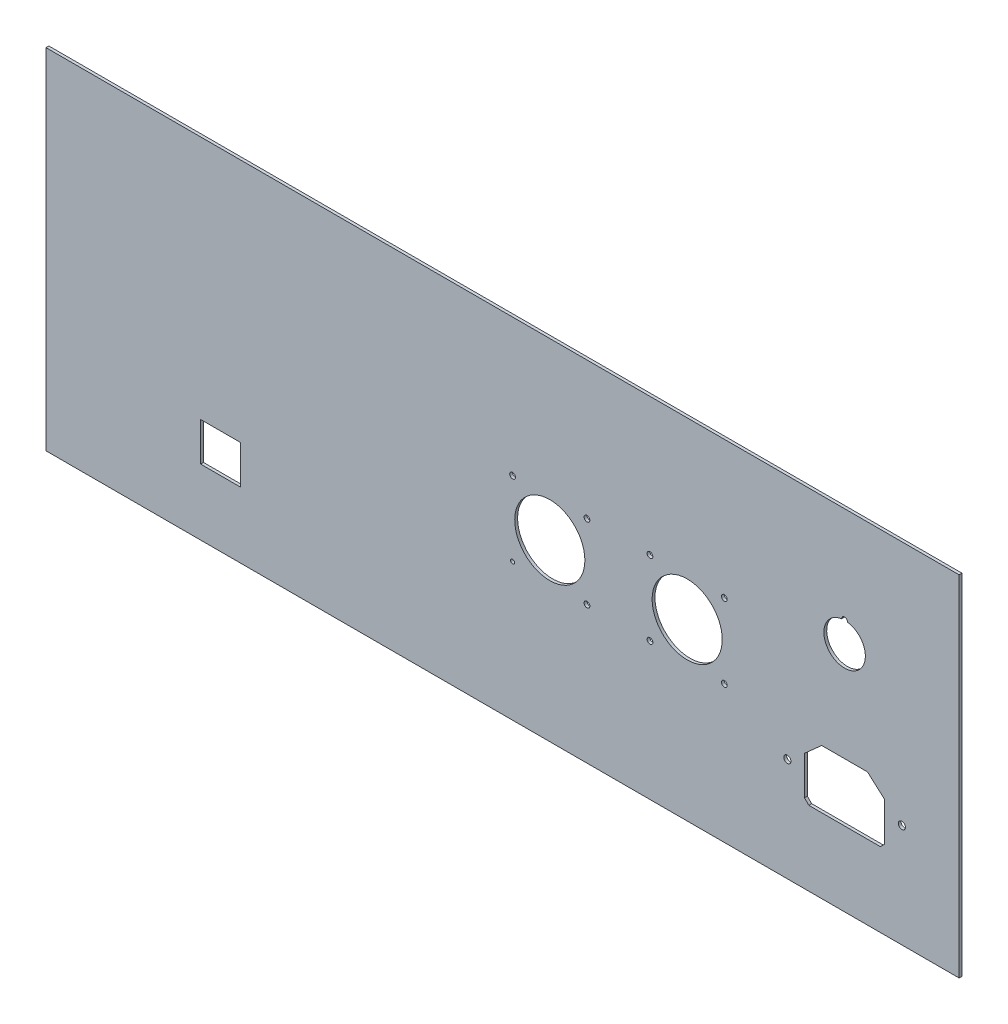
ISO-10303-21;
HEADER;
FILE_DESCRIPTION(('STEP AP214'),'2;1');
FILE_NAME('part.step','',(''),(''),'','','');
FILE_SCHEMA(('AUTOMOTIVE_DESIGN { 1 0 10303 214 1 1 1 1 }'));
ENDSEC;
DATA;
#1=APPLICATION_CONTEXT('core data for automotive mechanical design processes');
#2=APPLICATION_PROTOCOL_DEFINITION('international standard','automotive_design',2000,#1);
#3=PRODUCT_CONTEXT('',#1,'mechanical');
#4=PRODUCT('Part','Part','',(#3));
#5=PRODUCT_RELATED_PRODUCT_CATEGORY('part','',(#4));
#6=PRODUCT_DEFINITION_FORMATION('','',#4);
#7=PRODUCT_DEFINITION_CONTEXT('part definition',#1,'design');
#8=PRODUCT_DEFINITION('design','',#6,#7);
#9=PRODUCT_DEFINITION_SHAPE('','',#8);
#10=(LENGTH_UNIT() NAMED_UNIT(*) SI_UNIT(.MILLI.,.METRE.));
#11=(NAMED_UNIT(*) PLANE_ANGLE_UNIT() SI_UNIT($,.RADIAN.));
#12=(NAMED_UNIT(*) SI_UNIT($,.STERADIAN.) SOLID_ANGLE_UNIT());
#13=UNCERTAINTY_MEASURE_WITH_UNIT(LENGTH_MEASURE(1.E-05),#10,'distance_accuracy_value','');
#14=(GEOMETRIC_REPRESENTATION_CONTEXT(3) GLOBAL_UNCERTAINTY_ASSIGNED_CONTEXT((#13)) GLOBAL_UNIT_ASSIGNED_CONTEXT((#10,
#11,#12)) REPRESENTATION_CONTEXT('',''));
#15=CARTESIAN_POINT('',(0.,0.,0.));
#16=DIRECTION('',(0.,0.,1.));
#17=DIRECTION('',(1.,0.,0.));
#18=AXIS2_PLACEMENT_3D('',#15,#16,#17);
#19=CARTESIAN_POINT('',(-57.699950579006,25.5473317865429,-1.));
#20=DIRECTION('',(-1.,0.,0.));
#21=DIRECTION('',(0.,-1.,0.));
#22=AXIS2_PLACEMENT_3D('',#19,#20,#21);
#23=PLANE('',#22);
#24=DIRECTION('',(0.,-1.,0.));
#25=VECTOR('',#24,1.);
#26=CARTESIAN_POINT('',(-57.699950579006,25.5473317865429,0.));
#27=LINE('',#26,#25);
#28=CARTESIAN_POINT('',(-57.699950579006,25.5473317865429,0.));
#29=VERTEX_POINT('',#28);
#30=CARTESIAN_POINT('',(-57.6999505790059,-96.4526682134571,0.));
#31=VERTEX_POINT('',#30);
#32=EDGE_CURVE('E285',#29,#31,#27,.T.);
#33=ORIENTED_EDGE('',*,*,#32,.F.);
#34=DIRECTION('',(0.,0.,1.));
#35=VECTOR('',#34,1.);
#36=CARTESIAN_POINT('',(-57.699950579006,25.5473317865429,-1.));
#37=LINE('',#36,#35);
#38=CARTESIAN_POINT('',(-57.699950579006,25.5473317865429,-1.));
#39=VERTEX_POINT('',#38);
#40=EDGE_CURVE('E296',#39,#29,#37,.T.);
#41=ORIENTED_EDGE('',*,*,#40,.F.);
#42=DIRECTION('',(0.,-1.,0.));
#43=VECTOR('',#42,1.);
#44=CARTESIAN_POINT('',(-57.699950579006,25.5473317865429,-1.));
#45=LINE('',#44,#43);
#46=CARTESIAN_POINT('',(-57.6999505790059,-96.4526682134571,-1.));
#47=VERTEX_POINT('',#46);
#48=EDGE_CURVE('E271',#39,#47,#45,.T.);
#49=ORIENTED_EDGE('',*,*,#48,.T.);
#50=DIRECTION('',(0.,0.,1.));
#51=VECTOR('',#50,1.);
#52=CARTESIAN_POINT('',(-57.6999505790059,-96.4526682134571,-1.));
#53=LINE('',#52,#51);
#54=EDGE_CURVE('E284',#47,#31,#53,.T.);
#55=ORIENTED_EDGE('',*,*,#54,.T.);
#56=EDGE_LOOP('',(#33,#41,#49,#55));
#57=FACE_BOUND('',#56,.T.);
#58=ADVANCED_FACE('F35',(#57),#23,.T.);
#59=CARTESIAN_POINT('',(-57.699950579006,25.5473317865429,-1.));
#60=DIRECTION('',(0.,1.,0.));
#61=DIRECTION('',(0.,0.,1.));
#62=AXIS2_PLACEMENT_3D('',#59,#60,#61);
#63=PLANE('',#62);
#64=DIRECTION('',(-1.,0.,0.));
#65=VECTOR('',#64,1.);
#66=CARTESIAN_POINT('',(-57.699950579006,25.5473317865429,0.));
#67=LINE('',#66,#65);
#68=CARTESIAN_POINT('',(261.300049420994,25.5473317865429,0.));
#69=VERTEX_POINT('',#68);
#70=EDGE_CURVE('E275',#69,#29,#67,.T.);
#71=ORIENTED_EDGE('',*,*,#70,.F.);
#72=DIRECTION('',(0.,0.,1.));
#73=VECTOR('',#72,1.);
#74=CARTESIAN_POINT('',(261.300049420994,25.5473317865429,-1.));
#75=LINE('',#74,#73);
#76=CARTESIAN_POINT('',(261.300049420994,25.5473317865429,-1.));
#77=VERTEX_POINT('',#76);
#78=EDGE_CURVE('E299',#77,#69,#75,.T.);
#79=ORIENTED_EDGE('',*,*,#78,.F.);
#80=DIRECTION('',(-1.,0.,0.));
#81=VECTOR('',#80,1.);
#82=CARTESIAN_POINT('',(-57.699950579006,25.5473317865429,-1.));
#83=LINE('',#82,#81);
#84=EDGE_CURVE('E281',#77,#39,#83,.T.);
#85=ORIENTED_EDGE('',*,*,#84,.T.);
#86=ORIENTED_EDGE('',*,*,#40,.T.);
#87=EDGE_LOOP('',(#71,#79,#85,#86));
#88=FACE_BOUND('',#87,.T.);
#89=ADVANCED_FACE('F388',(#88),#63,.T.);
#90=CARTESIAN_POINT('',(261.300049420994,25.5473317865429,-1.));
#91=DIRECTION('',(1.,0.,0.));
#92=DIRECTION('',(0.,0.,-1.));
#93=AXIS2_PLACEMENT_3D('',#90,#91,#92);
#94=PLANE('',#93);
#95=DIRECTION('',(0.,1.,0.));
#96=VECTOR('',#95,1.);
#97=CARTESIAN_POINT('',(261.300049420994,25.5473317865429,0.));
#98=LINE('',#97,#96);
#99=CARTESIAN_POINT('',(261.300049420994,-96.4526682134571,0.));
#100=VERTEX_POINT('',#99);
#101=EDGE_CURVE('E291',#100,#69,#98,.T.);
#102=ORIENTED_EDGE('',*,*,#101,.F.);
#103=DIRECTION('',(0.,0.,1.));
#104=VECTOR('',#103,1.);
#105=CARTESIAN_POINT('',(261.300049420994,-96.4526682134571,-1.));
#106=LINE('',#105,#104);
#107=CARTESIAN_POINT('',(261.300049420994,-96.4526682134571,-1.));
#108=VERTEX_POINT('',#107);
#109=EDGE_CURVE('E301',#108,#100,#106,.T.);
#110=ORIENTED_EDGE('',*,*,#109,.F.);
#111=DIRECTION('',(0.,1.,0.));
#112=VECTOR('',#111,1.);
#113=CARTESIAN_POINT('',(261.300049420994,25.5473317865429,-1.));
#114=LINE('',#113,#112);
#115=EDGE_CURVE('E278',#108,#77,#114,.T.);
#116=ORIENTED_EDGE('',*,*,#115,.T.);
#117=ORIENTED_EDGE('',*,*,#78,.T.);
#118=EDGE_LOOP('',(#102,#110,#116,#117));
#119=FACE_BOUND('',#118,.T.);
#120=ADVANCED_FACE('F394',(#119),#94,.T.);
#121=CARTESIAN_POINT('',(-57.6999505790059,-96.4526682134571,-1.));
#122=DIRECTION('',(0.,-1.,0.));
#123=DIRECTION('',(0.,0.,-1.));
#124=AXIS2_PLACEMENT_3D('',#121,#122,#123);
#125=PLANE('',#124);
#126=DIRECTION('',(1.,0.,0.));
#127=VECTOR('',#126,1.);
#128=CARTESIAN_POINT('',(-57.6999505790059,-96.4526682134571,0.));
#129=LINE('',#128,#127);
#130=EDGE_CURVE('E288',#31,#100,#129,.T.);
#131=ORIENTED_EDGE('',*,*,#130,.F.);
#132=ORIENTED_EDGE('',*,*,#54,.F.);
#133=DIRECTION('',(1.,0.,0.));
#134=VECTOR('',#133,1.);
#135=CARTESIAN_POINT('',(-57.6999505790059,-96.4526682134571,-1.));
#136=LINE('',#135,#134);
#137=EDGE_CURVE('E274',#47,#108,#136,.T.);
#138=ORIENTED_EDGE('',*,*,#137,.T.);
#139=ORIENTED_EDGE('',*,*,#109,.T.);
#140=EDGE_LOOP('',(#131,#132,#138,#139));
#141=FACE_BOUND('',#140,.T.);
#142=ADVANCED_FACE('F399',(#141),#125,.T.);
#143=CARTESIAN_POINT('',(0.,0.,-1.));
#144=DIRECTION('',(0.,0.,1.));
#145=DIRECTION('',(1.,0.,0.));
#146=AXIS2_PLACEMENT_3D('',#143,#144,#145);
#147=PLANE('',#146);
#148=DIRECTION('',(-1.,0.,0.));
#149=VECTOR('',#148,1.);
#150=CARTESIAN_POINT('',(10.3000494209939,-73.452668213458,-1.));
#151=LINE('',#150,#149);
#152=CARTESIAN_POINT('',(10.3000494209939,-73.452668213458,-1.));
#153=VERTEX_POINT('',#152);
#154=CARTESIAN_POINT('',(-3.69995057900612,-73.452668213458,-1.));
#155=VERTEX_POINT('',#154);
#156=EDGE_CURVE('E171',#153,#155,#151,.T.);
#157=ORIENTED_EDGE('',*,*,#156,.F.);
#158=DIRECTION('',(0.,-1.,0.));
#159=VECTOR('',#158,1.);
#160=CARTESIAN_POINT('',(10.3000494209939,-59.952668213458,-1.));
#161=LINE('',#160,#159);
#162=CARTESIAN_POINT('',(10.3000494209939,-59.952668213458,-1.));
#163=VERTEX_POINT('',#162);
#164=EDGE_CURVE('E50',#163,#153,#161,.T.);
#165=ORIENTED_EDGE('',*,*,#164,.F.);
#166=DIRECTION('',(1.,0.,0.));
#167=VECTOR('',#166,1.);
#168=CARTESIAN_POINT('',(10.3000494209939,-59.952668213458,-1.));
#169=LINE('',#168,#167);
#170=CARTESIAN_POINT('',(-3.69995057900612,-59.952668213458,-1.));
#171=VERTEX_POINT('',#170);
#172=EDGE_CURVE('E178',#171,#163,#169,.T.);
#173=ORIENTED_EDGE('',*,*,#172,.F.);
#174=DIRECTION('',(0.,1.,0.));
#175=VECTOR('',#174,1.);
#176=CARTESIAN_POINT('',(-3.69995057900612,-59.952668213458,-1.));
#177=LINE('',#176,#175);
#178=EDGE_CURVE('E162',#155,#171,#177,.T.);
#179=ORIENTED_EDGE('',*,*,#178,.F.);
#180=EDGE_LOOP('',(#157,#165,#173,#179));
#181=FACE_BOUND('',#180,.T.);
#182=CARTESIAN_POINT('',(201.300049425371,-60.2752341321196,-1.));
#183=DIRECTION('',(0.,0.,-1.));
#184=DIRECTION('',(-1.,0.,0.));
#185=AXIS2_PLACEMENT_3D('',#182,#183,#184);
#186=CIRCLE('',#185,1.25000000000001);
#187=CARTESIAN_POINT('',(200.050049425371,-60.2752341321196,-1.));
#188=VERTEX_POINT('',#187);
#189=EDGE_CURVE('E185',#188,#188,#186,.T.);
#190=ORIENTED_EDGE('',*,*,#189,.F.);
#191=EDGE_LOOP('',(#190));
#192=FACE_BOUND('',#191,.T.);
#193=CARTESIAN_POINT('',(241.300049425371,-60.2752341321197,-1.));
#194=DIRECTION('',(0.,0.,-1.));
#195=DIRECTION('',(-1.,0.,0.));
#196=AXIS2_PLACEMENT_3D('',#193,#194,#195);
#197=CIRCLE('',#196,1.25000000000001);
#198=CARTESIAN_POINT('',(240.050049425371,-60.2752341321197,-1.));
#199=VERTEX_POINT('',#198);
#200=EDGE_CURVE('E191',#199,#199,#197,.T.);
#201=ORIENTED_EDGE('',*,*,#200,.F.);
#202=EDGE_LOOP('',(#201));
#203=FACE_BOUND('',#202,.T.);
#204=DIRECTION('',(0.746332426877867,0.66557336830029,0.));
#205=VECTOR('',#204,1.);
#206=CARTESIAN_POINT('',(213.300049420994,-50.1019155649255,-1.));
#207=LINE('',#206,#205);
#208=CARTESIAN_POINT('',(207.300049420994,-55.4526682134571,-1.));
#209=VERTEX_POINT('',#208);
#210=CARTESIAN_POINT('',(213.300049420994,-50.1019155649255,-1.));
#211=VERTEX_POINT('',#210);
#212=EDGE_CURVE('E197',#209,#211,#207,.T.);
#213=ORIENTED_EDGE('',*,*,#212,.F.);
#214=DIRECTION('',(0.,1.,0.));
#215=VECTOR('',#214,1.);
#216=CARTESIAN_POINT('',(207.300049420994,-55.4526682134571,-1.));
#217=LINE('',#216,#215);
#218=CARTESIAN_POINT('',(207.300049420994,-68.9526682134571,-1.));
#219=VERTEX_POINT('',#218);
#220=EDGE_CURVE('E195',#219,#209,#217,.T.);
#221=ORIENTED_EDGE('',*,*,#220,.F.);
#222=DIRECTION('',(-0.707106781186548,0.707106781186548,0.));
#223=VECTOR('',#222,1.);
#224=CARTESIAN_POINT('',(69.1736906037684,69.1736906037684,-1.));
#225=LINE('',#224,#223);
#226=CARTESIAN_POINT('',(208.800049420994,-70.4526682134571,-1.));
#227=VERTEX_POINT('',#226);
#228=EDGE_CURVE('E357',#219,#227,#225,.F.);
#229=ORIENTED_EDGE('',*,*,#228,.T.);
#230=DIRECTION('',(-1.,0.,0.));
#231=VECTOR('',#230,1.);
#232=CARTESIAN_POINT('',(235.300049420994,-70.4526682134571,-1.));
#233=LINE('',#232,#231);
#234=CARTESIAN_POINT('',(233.800049420994,-70.4526682134571,-1.));
#235=VERTEX_POINT('',#234);
#236=EDGE_CURVE('E209',#235,#227,#233,.T.);
#237=ORIENTED_EDGE('',*,*,#236,.F.);
#238=DIRECTION('',(-0.707106781186548,-0.707106781186548,0.));
#239=VECTOR('',#238,1.);
#240=CARTESIAN_POINT('',(152.126358817226,-152.126358817226,-1.));
#241=LINE('',#240,#239);
#242=CARTESIAN_POINT('',(235.300049420994,-68.952668213457,-1.));
#243=VERTEX_POINT('',#242);
#244=EDGE_CURVE('E361',#235,#243,#241,.F.);
#245=ORIENTED_EDGE('',*,*,#244,.T.);
#246=DIRECTION('',(0.,-1.,0.));
#247=VECTOR('',#246,1.);
#248=CARTESIAN_POINT('',(235.300049420994,-55.4526682134571,-1.));
#249=LINE('',#248,#247);
#250=CARTESIAN_POINT('',(235.300049420994,-55.4526682134571,-1.));
#251=VERTEX_POINT('',#250);
#252=EDGE_CURVE('E206',#251,#243,#249,.T.);
#253=ORIENTED_EDGE('',*,*,#252,.F.);
#254=DIRECTION('',(0.746332426877865,-0.665573368300292,0.));
#255=VECTOR('',#254,1.);
#256=CARTESIAN_POINT('',(229.300049420994,-50.1019155649255,-1.));
#257=LINE('',#256,#255);
#258=CARTESIAN_POINT('',(229.300049420994,-50.1019155649255,-1.));
#259=VERTEX_POINT('',#258);
#260=EDGE_CURVE('E203',#259,#251,#257,.T.);
#261=ORIENTED_EDGE('',*,*,#260,.F.);
#262=DIRECTION('',(1.,0.,0.));
#263=VECTOR('',#262,1.);
#264=CARTESIAN_POINT('',(229.300049420994,-50.1019155649255,-1.));
#265=LINE('',#264,#263);
#266=EDGE_CURVE('E200',#211,#259,#265,.T.);
#267=ORIENTED_EDGE('',*,*,#266,.F.);
#268=EDGE_LOOP('',(#213,#221,#229,#237,#245,#253,#261,#267));
#269=FACE_BOUND('',#268,.T.);
#270=CARTESIAN_POINT('',(105.300049420994,-22.4526682134571,-1.));
#271=DIRECTION('',(0.,0.,-1.));
#272=DIRECTION('',(-1.,0.,0.));
#273=AXIS2_PLACEMENT_3D('',#270,#271,#272);
#274=CIRCLE('',#273,0.999999999999998);
#275=CARTESIAN_POINT('',(104.300049420994,-22.4526682134571,-1.));
#276=VERTEX_POINT('',#275);
#277=EDGE_CURVE('E215',#276,#276,#274,.T.);
#278=ORIENTED_EDGE('',*,*,#277,.F.);
#279=EDGE_LOOP('',(#278));
#280=FACE_BOUND('',#279,.T.);
#281=CARTESIAN_POINT('',(131.300049420994,-22.452668213457,-1.));
#282=DIRECTION('',(0.,0.,-1.));
#283=DIRECTION('',(-1.,0.,0.));
#284=AXIS2_PLACEMENT_3D('',#281,#282,#283);
#285=CIRCLE('',#284,0.999999999999998);
#286=CARTESIAN_POINT('',(130.300049420994,-22.452668213457,-1.));
#287=VERTEX_POINT('',#286);
#288=EDGE_CURVE('E225',#287,#287,#285,.T.);
#289=ORIENTED_EDGE('',*,*,#288,.F.);
#290=EDGE_LOOP('',(#289));
#291=FACE_BOUND('',#290,.T.);
#292=CARTESIAN_POINT('',(105.300049420994,-48.4526682134571,-1.));
#293=DIRECTION('',(0.,0.,-1.));
#294=DIRECTION('',(-1.,0.,0.));
#295=AXIS2_PLACEMENT_3D('',#292,#293,#294);
#296=CIRCLE('',#295,0.707106781186551);
#297=CARTESIAN_POINT('',(104.592942639808,-48.4526682134571,-1.));
#298=VERTEX_POINT('',#297);
#299=EDGE_CURVE('E229',#298,#298,#296,.T.);
#300=ORIENTED_EDGE('',*,*,#299,.F.);
#301=EDGE_LOOP('',(#300));
#302=FACE_BOUND('',#301,.T.);
#303=CARTESIAN_POINT('',(131.300049420994,-48.452668213457,-1.));
#304=DIRECTION('',(0.,0.,-1.));
#305=DIRECTION('',(-1.,0.,0.));
#306=AXIS2_PLACEMENT_3D('',#303,#304,#305);
#307=CIRCLE('',#306,0.999999999999998);
#308=CARTESIAN_POINT('',(130.300049420994,-48.452668213457,-1.));
#309=VERTEX_POINT('',#308);
#310=EDGE_CURVE('E233',#309,#309,#307,.T.);
#311=ORIENTED_EDGE('',*,*,#310,.F.);
#312=EDGE_LOOP('',(#311));
#313=FACE_BOUND('',#312,.T.);
#314=CARTESIAN_POINT('',(153.300049420994,-48.452668213457,-1.));
#315=DIRECTION('',(0.,0.,-1.));
#316=DIRECTION('',(-1.,0.,0.));
#317=AXIS2_PLACEMENT_3D('',#314,#315,#316);
#318=CIRCLE('',#317,0.999999999999998);
#319=CARTESIAN_POINT('',(152.300049420994,-48.452668213457,-1.));
#320=VERTEX_POINT('',#319);
#321=EDGE_CURVE('E237',#320,#320,#318,.T.);
#322=ORIENTED_EDGE('',*,*,#321,.F.);
#323=EDGE_LOOP('',(#322));
#324=FACE_BOUND('',#323,.T.);
#325=CARTESIAN_POINT('',(179.300049420994,-48.4526682134569,-1.));
#326=DIRECTION('',(0.,0.,-1.));
#327=DIRECTION('',(-1.,0.,0.));
#328=AXIS2_PLACEMENT_3D('',#325,#326,#327);
#329=CIRCLE('',#328,0.999999999999998);
#330=CARTESIAN_POINT('',(178.300049420994,-48.4526682134569,-1.));
#331=VERTEX_POINT('',#330);
#332=EDGE_CURVE('E241',#331,#331,#329,.T.);
#333=ORIENTED_EDGE('',*,*,#332,.F.);
#334=EDGE_LOOP('',(#333));
#335=FACE_BOUND('',#334,.T.);
#336=CARTESIAN_POINT('',(153.300049420994,-22.452668213457,-1.));
#337=DIRECTION('',(0.,0.,-1.));
#338=DIRECTION('',(-1.,0.,0.));
#339=AXIS2_PLACEMENT_3D('',#336,#337,#338);
#340=CIRCLE('',#339,0.999999999999998);
#341=CARTESIAN_POINT('',(152.300049420994,-22.452668213457,-1.));
#342=VERTEX_POINT('',#341);
#343=EDGE_CURVE('E245',#342,#342,#340,.T.);
#344=ORIENTED_EDGE('',*,*,#343,.F.);
#345=EDGE_LOOP('',(#344));
#346=FACE_BOUND('',#345,.T.);
#347=CARTESIAN_POINT('',(179.300049420994,-22.4526682134569,-1.));
#348=DIRECTION('',(0.,0.,-1.));
#349=DIRECTION('',(-1.,0.,0.));
#350=AXIS2_PLACEMENT_3D('',#347,#348,#349);
#351=CIRCLE('',#350,0.999999999999998);
#352=CARTESIAN_POINT('',(178.300049420994,-22.4526682134569,-1.));
#353=VERTEX_POINT('',#352);
#354=EDGE_CURVE('E249',#353,#353,#351,.T.);
#355=ORIENTED_EDGE('',*,*,#354,.F.);
#356=EDGE_LOOP('',(#355));
#357=FACE_BOUND('',#356,.T.);
#358=CARTESIAN_POINT('',(221.300049420994,-15.4526682134571,-1.));
#359=DIRECTION('',(0.,0.,-1.));
#360=DIRECTION('',(-1.,0.,0.));
#361=AXIS2_PLACEMENT_3D('',#358,#359,#360);
#362=CIRCLE('',#361,7.25);
#363=CARTESIAN_POINT('',(222.297668465235,-8.27163373069846,-1.));
#364=VERTEX_POINT('',#363);
#365=CARTESIAN_POINT('',(220.302430376753,-8.27163373069846,-1.));
#366=VERTEX_POINT('',#365);
#367=EDGE_CURVE('E255',#364,#366,#362,.T.);
#368=ORIENTED_EDGE('',*,*,#367,.F.);
#369=CARTESIAN_POINT('',(221.300049420994,-8.20266821345708,-1.));
#370=DIRECTION('',(0.,0.,-1.));
#371=DIRECTION('',(-1.,0.,0.));
#372=AXIS2_PLACEMENT_3D('',#369,#370,#371);
#373=CIRCLE('',#372,0.999999999999994);
#374=EDGE_CURVE('E253',#366,#364,#373,.T.);
#375=ORIENTED_EDGE('',*,*,#374,.F.);
#376=EDGE_LOOP('',(#368,#375));
#377=FACE_BOUND('',#376,.T.);
#378=CARTESIAN_POINT('',(118.300049420994,-35.4526682134571,-1.));
#379=DIRECTION('',(0.,0.,-1.));
#380=DIRECTION('',(-1.,0.,0.));
#381=AXIS2_PLACEMENT_3D('',#378,#379,#380);
#382=CIRCLE('',#381,12.25);
#383=CARTESIAN_POINT('',(106.050049420994,-35.4526682134571,-1.));
#384=VERTEX_POINT('',#383);
#385=EDGE_CURVE('E261',#384,#384,#382,.T.);
#386=ORIENTED_EDGE('',*,*,#385,.F.);
#387=EDGE_LOOP('',(#386));
#388=FACE_BOUND('',#387,.T.);
#389=CARTESIAN_POINT('',(166.300049420994,-35.4526682134571,-1.));
#390=DIRECTION('',(0.,0.,-1.));
#391=DIRECTION('',(-1.,0.,0.));
#392=AXIS2_PLACEMENT_3D('',#389,#390,#391);
#393=CIRCLE('',#392,12.25);
#394=CARTESIAN_POINT('',(154.050049420994,-35.4526682134571,-1.));
#395=VERTEX_POINT('',#394);
#396=EDGE_CURVE('E267',#395,#395,#393,.T.);
#397=ORIENTED_EDGE('',*,*,#396,.F.);
#398=EDGE_LOOP('',(#397));
#399=FACE_BOUND('',#398,.T.);
#400=ORIENTED_EDGE('',*,*,#48,.F.);
#401=ORIENTED_EDGE('',*,*,#84,.F.);
#402=ORIENTED_EDGE('',*,*,#115,.F.);
#403=ORIENTED_EDGE('',*,*,#137,.F.);
#404=EDGE_LOOP('',(#400,#401,#402,#403));
#405=FACE_BOUND('',#404,.T.);
#406=ADVANCED_FACE('F175',(#181,#192,#203,#269,#280,#291,#302,#313,#324,#335,#346,#357,#377,
#388,#399,#405),#147,.F.);
#407=CARTESIAN_POINT('',(0.,0.,0.));
#408=DIRECTION('',(0.,0.,1.));
#409=DIRECTION('',(1.,0.,0.));
#410=AXIS2_PLACEMENT_3D('',#407,#408,#409);
#411=PLANE('',#410);
#412=DIRECTION('',(0.,1.,0.));
#413=VECTOR('',#412,1.);
#414=CARTESIAN_POINT('',(10.3000494209939,0.,0.));
#415=LINE('',#414,#413);
#416=CARTESIAN_POINT('',(10.3000494209939,-73.452668213458,0.));
#417=VERTEX_POINT('',#416);
#418=CARTESIAN_POINT('',(10.3000494209939,-59.952668213458,0.));
#419=VERTEX_POINT('',#418);
#420=EDGE_CURVE('E11',#417,#419,#415,.T.);
#421=ORIENTED_EDGE('',*,*,#420,.F.);
#422=DIRECTION('',(1.,0.,0.));
#423=VECTOR('',#422,1.);
#424=CARTESIAN_POINT('',(0.,-73.452668213458,0.));
#425=LINE('',#424,#423);
#426=CARTESIAN_POINT('',(-3.69995057900612,-73.452668213458,0.));
#427=VERTEX_POINT('',#426);
#428=EDGE_CURVE('E365',#427,#417,#425,.T.);
#429=ORIENTED_EDGE('',*,*,#428,.F.);
#430=DIRECTION('',(0.,-1.,0.));
#431=VECTOR('',#430,1.);
#432=CARTESIAN_POINT('',(-3.69995057900612,0.,0.));
#433=LINE('',#432,#431);
#434=CARTESIAN_POINT('',(-3.69995057900612,-59.952668213458,0.));
#435=VERTEX_POINT('',#434);
#436=EDGE_CURVE('E165',#435,#427,#433,.T.);
#437=ORIENTED_EDGE('',*,*,#436,.F.);
#438=DIRECTION('',(-1.,0.,0.));
#439=VECTOR('',#438,1.);
#440=CARTESIAN_POINT('',(0.,-59.952668213458,0.));
#441=LINE('',#440,#439);
#442=EDGE_CURVE('E43',#419,#435,#441,.T.);
#443=ORIENTED_EDGE('',*,*,#442,.F.);
#444=EDGE_LOOP('',(#421,#429,#437,#443));
#445=FACE_BOUND('',#444,.T.);
#446=CARTESIAN_POINT('',(201.300049425371,-60.2752341321196,0.));
#447=DIRECTION('',(0.,0.,1.));
#448=DIRECTION('',(1.,0.,0.));
#449=AXIS2_PLACEMENT_3D('',#446,#447,#448);
#450=CIRCLE('',#449,1.25000000000001);
#451=CARTESIAN_POINT('',(202.550049425371,-60.2752341321196,0.));
#452=VERTEX_POINT('',#451);
#453=EDGE_CURVE('E190',#452,#452,#450,.T.);
#454=ORIENTED_EDGE('',*,*,#453,.F.);
#455=EDGE_LOOP('',(#454));
#456=FACE_BOUND('',#455,.T.);
#457=CARTESIAN_POINT('',(241.300049425371,-60.2752341321197,0.));
#458=DIRECTION('',(0.,0.,1.));
#459=DIRECTION('',(1.,0.,0.));
#460=AXIS2_PLACEMENT_3D('',#457,#458,#459);
#461=CIRCLE('',#460,1.25000000000001);
#462=CARTESIAN_POINT('',(242.550049425371,-60.2752341321197,0.));
#463=VERTEX_POINT('',#462);
#464=EDGE_CURVE('E194',#463,#463,#461,.T.);
#465=ORIENTED_EDGE('',*,*,#464,.F.);
#466=EDGE_LOOP('',(#465));
#467=FACE_BOUND('',#466,.T.);
#468=DIRECTION('',(0.,-1.,0.));
#469=VECTOR('',#468,1.);
#470=CARTESIAN_POINT('',(207.300049420994,0.,0.));
#471=LINE('',#470,#469);
#472=CARTESIAN_POINT('',(207.300049420994,-55.4526682134571,0.));
#473=VERTEX_POINT('',#472);
#474=CARTESIAN_POINT('',(207.300049420994,-68.9526682134571,0.));
#475=VERTEX_POINT('',#474);
#476=EDGE_CURVE('E340',#473,#475,#471,.T.);
#477=ORIENTED_EDGE('',*,*,#476,.F.);
#478=DIRECTION('',(-0.746332426877867,-0.66557336830029,0.));
#479=VECTOR('',#478,1.);
#480=CARTESIAN_POINT('',(119.376917591222,-133.861823297681,0.));
#481=LINE('',#480,#479);
#482=CARTESIAN_POINT('',(213.300049420994,-50.1019155649255,0.));
#483=VERTEX_POINT('',#482);
#484=EDGE_CURVE('E312',#483,#473,#481,.T.);
#485=ORIENTED_EDGE('',*,*,#484,.F.);
#486=DIRECTION('',(-1.,0.,0.));
#487=VECTOR('',#486,1.);
#488=CARTESIAN_POINT('',(0.,-50.1019155649255,0.));
#489=LINE('',#488,#487);
#490=CARTESIAN_POINT('',(229.300049420994,-50.1019155649255,0.));
#491=VERTEX_POINT('',#490);
#492=EDGE_CURVE('E330',#491,#483,#489,.T.);
#493=ORIENTED_EDGE('',*,*,#492,.F.);
#494=DIRECTION('',(-0.746332426877865,0.665573368300292,0.));
#495=VECTOR('',#494,1.);
#496=CARTESIAN_POINT('',(76.6895745367809,85.9949015484692,0.));
#497=LINE('',#496,#495);
#498=CARTESIAN_POINT('',(235.300049420994,-55.4526682134571,0.));
#499=VERTEX_POINT('',#498);
#500=EDGE_CURVE('E333',#499,#491,#497,.T.);
#501=ORIENTED_EDGE('',*,*,#500,.F.);
#502=DIRECTION('',(0.,1.,0.));
#503=VECTOR('',#502,1.);
#504=CARTESIAN_POINT('',(235.300049420994,4.35392554271041E-13,0.));
#505=LINE('',#504,#503);
#506=CARTESIAN_POINT('',(235.300049420994,-68.952668213457,0.));
#507=VERTEX_POINT('',#506);
#508=EDGE_CURVE('E335',#507,#499,#505,.T.);
#509=ORIENTED_EDGE('',*,*,#508,.F.);
#510=DIRECTION('',(0.707106781186548,0.707106781186548,0.));
#511=VECTOR('',#510,1.);
#512=CARTESIAN_POINT('',(233.800049420994,-70.4526682134571,0.));
#513=LINE('',#512,#511);
#514=CARTESIAN_POINT('',(233.800049420994,-70.4526682134571,0.));
#515=VERTEX_POINT('',#514);
#516=EDGE_CURVE('E363',#507,#515,#513,.F.);
#517=ORIENTED_EDGE('',*,*,#516,.T.);
#518=DIRECTION('',(1.,0.,0.));
#519=VECTOR('',#518,1.);
#520=CARTESIAN_POINT('',(0.,-70.4526682134571,0.));
#521=LINE('',#520,#519);
#522=CARTESIAN_POINT('',(208.800049420994,-70.4526682134571,0.));
#523=VERTEX_POINT('',#522);
#524=EDGE_CURVE('E337',#523,#515,#521,.T.);
#525=ORIENTED_EDGE('',*,*,#524,.F.);
#526=DIRECTION('',(0.707106781186548,-0.707106781186548,0.));
#527=VECTOR('',#526,1.);
#528=CARTESIAN_POINT('',(207.300049420994,-68.9526682134571,0.));
#529=LINE('',#528,#527);
#530=EDGE_CURVE('E359',#523,#475,#529,.F.);
#531=ORIENTED_EDGE('',*,*,#530,.T.);
#532=EDGE_LOOP('',(#477,#485,#493,#501,#509,#517,#525,#531));
#533=FACE_BOUND('',#532,.T.);
#534=CARTESIAN_POINT('',(105.300049420994,-22.4526682134571,0.));
#535=DIRECTION('',(0.,0.,1.));
#536=DIRECTION('',(1.,0.,0.));
#537=AXIS2_PLACEMENT_3D('',#534,#535,#536);
#538=CIRCLE('',#537,0.999999999999998);
#539=CARTESIAN_POINT('',(106.300049420994,-22.4526682134571,0.));
#540=VERTEX_POINT('',#539);
#541=EDGE_CURVE('E224',#540,#540,#538,.T.);
#542=ORIENTED_EDGE('',*,*,#541,.F.);
#543=EDGE_LOOP('',(#542));
#544=FACE_BOUND('',#543,.T.);
#545=CARTESIAN_POINT('',(131.300049420994,-22.452668213457,0.));
#546=DIRECTION('',(0.,0.,1.));
#547=DIRECTION('',(1.,0.,0.));
#548=AXIS2_PLACEMENT_3D('',#545,#546,#547);
#549=CIRCLE('',#548,0.999999999999998);
#550=CARTESIAN_POINT('',(132.300049420994,-22.452668213457,0.));
#551=VERTEX_POINT('',#550);
#552=EDGE_CURVE('E228',#551,#551,#549,.T.);
#553=ORIENTED_EDGE('',*,*,#552,.F.);
#554=EDGE_LOOP('',(#553));
#555=FACE_BOUND('',#554,.T.);
#556=CARTESIAN_POINT('',(105.300049420994,-48.4526682134571,0.));
#557=DIRECTION('',(0.,0.,1.));
#558=DIRECTION('',(1.,0.,0.));
#559=AXIS2_PLACEMENT_3D('',#556,#557,#558);
#560=CIRCLE('',#559,0.707106781186551);
#561=CARTESIAN_POINT('',(106.007156202181,-48.4526682134571,0.));
#562=VERTEX_POINT('',#561);
#563=EDGE_CURVE('E232',#562,#562,#560,.T.);
#564=ORIENTED_EDGE('',*,*,#563,.F.);
#565=EDGE_LOOP('',(#564));
#566=FACE_BOUND('',#565,.T.);
#567=CARTESIAN_POINT('',(131.300049420994,-48.452668213457,0.));
#568=DIRECTION('',(0.,0.,1.));
#569=DIRECTION('',(1.,0.,0.));
#570=AXIS2_PLACEMENT_3D('',#567,#568,#569);
#571=CIRCLE('',#570,0.999999999999998);
#572=CARTESIAN_POINT('',(132.300049420994,-48.452668213457,0.));
#573=VERTEX_POINT('',#572);
#574=EDGE_CURVE('E236',#573,#573,#571,.T.);
#575=ORIENTED_EDGE('',*,*,#574,.F.);
#576=EDGE_LOOP('',(#575));
#577=FACE_BOUND('',#576,.T.);
#578=CARTESIAN_POINT('',(153.300049420994,-48.452668213457,0.));
#579=DIRECTION('',(0.,0.,1.));
#580=DIRECTION('',(1.,0.,0.));
#581=AXIS2_PLACEMENT_3D('',#578,#579,#580);
#582=CIRCLE('',#581,0.999999999999998);
#583=CARTESIAN_POINT('',(154.300049420994,-48.452668213457,0.));
#584=VERTEX_POINT('',#583);
#585=EDGE_CURVE('E240',#584,#584,#582,.T.);
#586=ORIENTED_EDGE('',*,*,#585,.F.);
#587=EDGE_LOOP('',(#586));
#588=FACE_BOUND('',#587,.T.);
#589=CARTESIAN_POINT('',(179.300049420994,-48.4526682134569,0.));
#590=DIRECTION('',(0.,0.,1.));
#591=DIRECTION('',(1.,0.,0.));
#592=AXIS2_PLACEMENT_3D('',#589,#590,#591);
#593=CIRCLE('',#592,0.999999999999998);
#594=CARTESIAN_POINT('',(180.300049420994,-48.4526682134569,0.));
#595=VERTEX_POINT('',#594);
#596=EDGE_CURVE('E244',#595,#595,#593,.T.);
#597=ORIENTED_EDGE('',*,*,#596,.F.);
#598=EDGE_LOOP('',(#597));
#599=FACE_BOUND('',#598,.T.);
#600=CARTESIAN_POINT('',(153.300049420994,-22.452668213457,0.));
#601=DIRECTION('',(0.,0.,1.));
#602=DIRECTION('',(1.,0.,0.));
#603=AXIS2_PLACEMENT_3D('',#600,#601,#602);
#604=CIRCLE('',#603,0.999999999999998);
#605=CARTESIAN_POINT('',(154.300049420994,-22.452668213457,0.));
#606=VERTEX_POINT('',#605);
#607=EDGE_CURVE('E248',#606,#606,#604,.T.);
#608=ORIENTED_EDGE('',*,*,#607,.F.);
#609=EDGE_LOOP('',(#608));
#610=FACE_BOUND('',#609,.T.);
#611=CARTESIAN_POINT('',(179.300049420994,-22.4526682134569,0.));
#612=DIRECTION('',(0.,0.,1.));
#613=DIRECTION('',(1.,0.,0.));
#614=AXIS2_PLACEMENT_3D('',#611,#612,#613);
#615=CIRCLE('',#614,0.999999999999998);
#616=CARTESIAN_POINT('',(180.300049420994,-22.4526682134569,0.));
#617=VERTEX_POINT('',#616);
#618=EDGE_CURVE('E252',#617,#617,#615,.T.);
#619=ORIENTED_EDGE('',*,*,#618,.F.);
#620=EDGE_LOOP('',(#619));
#621=FACE_BOUND('',#620,.T.);
#622=CARTESIAN_POINT('',(221.300049420994,-8.20266821345708,0.));
#623=DIRECTION('',(0.,0.,1.));
#624=DIRECTION('',(1.,0.,0.));
#625=AXIS2_PLACEMENT_3D('',#622,#623,#624);
#626=CIRCLE('',#625,0.999999999999994);
#627=CARTESIAN_POINT('',(222.297668465235,-8.27163373069846,0.));
#628=VERTEX_POINT('',#627);
#629=CARTESIAN_POINT('',(220.302430376753,-8.27163373069846,0.));
#630=VERTEX_POINT('',#629);
#631=EDGE_CURVE('E309',#628,#630,#626,.T.);
#632=ORIENTED_EDGE('',*,*,#631,.F.);
#633=CARTESIAN_POINT('',(221.300049420994,-15.4526682134571,0.));
#634=DIRECTION('',(0.,0.,1.));
#635=DIRECTION('',(1.,0.,0.));
#636=AXIS2_PLACEMENT_3D('',#633,#634,#635);
#637=CIRCLE('',#636,7.25);
#638=EDGE_CURVE('E298',#630,#628,#637,.T.);
#639=ORIENTED_EDGE('',*,*,#638,.F.);
#640=EDGE_LOOP('',(#632,#639));
#641=FACE_BOUND('',#640,.T.);
#642=CARTESIAN_POINT('',(118.300049420994,-35.4526682134571,0.));
#643=DIRECTION('',(0.,0.,1.));
#644=DIRECTION('',(1.,0.,0.));
#645=AXIS2_PLACEMENT_3D('',#642,#643,#644);
#646=CIRCLE('',#645,12.25);
#647=CARTESIAN_POINT('',(130.550049420994,-35.4526682134571,0.));
#648=VERTEX_POINT('',#647);
#649=EDGE_CURVE('E266',#648,#648,#646,.T.);
#650=ORIENTED_EDGE('',*,*,#649,.F.);
#651=EDGE_LOOP('',(#650));
#652=FACE_BOUND('',#651,.T.);
#653=CARTESIAN_POINT('',(166.300049420994,-35.4526682134571,0.));
#654=DIRECTION('',(0.,0.,1.));
#655=DIRECTION('',(1.,0.,0.));
#656=AXIS2_PLACEMENT_3D('',#653,#654,#655);
#657=CIRCLE('',#656,12.25);
#658=CARTESIAN_POINT('',(178.550049420994,-35.4526682134571,0.));
#659=VERTEX_POINT('',#658);
#660=EDGE_CURVE('E270',#659,#659,#657,.T.);
#661=ORIENTED_EDGE('',*,*,#660,.F.);
#662=EDGE_LOOP('',(#661));
#663=FACE_BOUND('',#662,.T.);
#664=ORIENTED_EDGE('',*,*,#32,.T.);
#665=ORIENTED_EDGE('',*,*,#130,.T.);
#666=ORIENTED_EDGE('',*,*,#101,.T.);
#667=ORIENTED_EDGE('',*,*,#70,.T.);
#668=EDGE_LOOP('',(#664,#665,#666,#667));
#669=FACE_BOUND('',#668,.T.);
#670=ADVANCED_FACE('F373',(#445,#456,#467,#533,#544,#555,#566,#577,#588,#599,#610,#621,#641,
#652,#663,#669),#411,.T.);
#671=CARTESIAN_POINT('',(166.300049420994,-35.4526682134571,9.));
#672=DIRECTION('',(0.,0.,-1.));
#673=DIRECTION('',(-1.,0.,0.));
#674=AXIS2_PLACEMENT_3D('',#671,#672,#673);
#675=CYLINDRICAL_SURFACE('',#674,12.25);
#676=ORIENTED_EDGE('',*,*,#660,.T.);
#677=EDGE_LOOP('',(#676));
#678=FACE_BOUND('',#677,.T.);
#679=ORIENTED_EDGE('',*,*,#396,.T.);
#680=EDGE_LOOP('',(#679));
#681=FACE_BOUND('',#680,.T.);
#682=ADVANCED_FACE('F505',(#678,#681),#675,.F.);
#683=CARTESIAN_POINT('',(118.300049420994,-35.4526682134571,9.));
#684=DIRECTION('',(0.,0.,-1.));
#685=DIRECTION('',(-1.,0.,0.));
#686=AXIS2_PLACEMENT_3D('',#683,#684,#685);
#687=CYLINDRICAL_SURFACE('',#686,12.25);
#688=ORIENTED_EDGE('',*,*,#649,.T.);
#689=EDGE_LOOP('',(#688));
#690=FACE_BOUND('',#689,.T.);
#691=ORIENTED_EDGE('',*,*,#385,.T.);
#692=EDGE_LOOP('',(#691));
#693=FACE_BOUND('',#692,.T.);
#694=ADVANCED_FACE('F501',(#690,#693),#687,.F.);
#695=CARTESIAN_POINT('',(221.300049420994,-8.20266821345708,9.));
#696=DIRECTION('',(0.,0.,-1.));
#697=DIRECTION('',(-1.,0.,0.));
#698=AXIS2_PLACEMENT_3D('',#695,#696,#697);
#699=CYLINDRICAL_SURFACE('',#698,0.999999999999994);
#700=ORIENTED_EDGE('',*,*,#631,.T.);
#701=DIRECTION('',(0.,0.,-1.));
#702=VECTOR('',#701,1.);
#703=CARTESIAN_POINT('',(220.302430376753,-8.27163373069846,9.));
#704=LINE('',#703,#702);
#705=EDGE_CURVE('E259',#630,#366,#704,.T.);
#706=ORIENTED_EDGE('',*,*,#705,.T.);
#707=ORIENTED_EDGE('',*,*,#374,.T.);
#708=DIRECTION('',(0.,0.,-1.));
#709=VECTOR('',#708,1.);
#710=CARTESIAN_POINT('',(222.297668465235,-8.27163373069846,9.));
#711=LINE('',#710,#709);
#712=EDGE_CURVE('E258',#628,#364,#711,.T.);
#713=ORIENTED_EDGE('',*,*,#712,.F.);
#714=EDGE_LOOP('',(#700,#706,#707,#713));
#715=FACE_BOUND('',#714,.T.);
#716=ADVANCED_FACE('F497',(#715),#699,.F.);
#717=CARTESIAN_POINT('',(221.300049420994,-15.4526682134571,9.));
#718=DIRECTION('',(0.,0.,-1.));
#719=DIRECTION('',(-1.,0.,0.));
#720=AXIS2_PLACEMENT_3D('',#717,#718,#719);
#721=CYLINDRICAL_SURFACE('',#720,7.25);
#722=ORIENTED_EDGE('',*,*,#638,.T.);
#723=ORIENTED_EDGE('',*,*,#712,.T.);
#724=ORIENTED_EDGE('',*,*,#367,.T.);
#725=ORIENTED_EDGE('',*,*,#705,.F.);
#726=EDGE_LOOP('',(#722,#723,#724,#725));
#727=FACE_BOUND('',#726,.T.);
#728=ADVANCED_FACE('F493',(#727),#721,.F.);
#729=CARTESIAN_POINT('',(179.300049420994,-22.4526682134569,9.));
#730=DIRECTION('',(0.,0.,-1.));
#731=DIRECTION('',(-1.,0.,0.));
#732=AXIS2_PLACEMENT_3D('',#729,#730,#731);
#733=CYLINDRICAL_SURFACE('',#732,0.999999999999998);
#734=ORIENTED_EDGE('',*,*,#618,.T.);
#735=EDGE_LOOP('',(#734));
#736=FACE_BOUND('',#735,.T.);
#737=ORIENTED_EDGE('',*,*,#354,.T.);
#738=EDGE_LOOP('',(#737));
#739=FACE_BOUND('',#738,.T.);
#740=ADVANCED_FACE('F489',(#736,#739),#733,.F.);
#741=CARTESIAN_POINT('',(153.300049420994,-22.452668213457,9.));
#742=DIRECTION('',(0.,0.,-1.));
#743=DIRECTION('',(-1.,0.,0.));
#744=AXIS2_PLACEMENT_3D('',#741,#742,#743);
#745=CYLINDRICAL_SURFACE('',#744,0.999999999999998);
#746=ORIENTED_EDGE('',*,*,#607,.T.);
#747=EDGE_LOOP('',(#746));
#748=FACE_BOUND('',#747,.T.);
#749=ORIENTED_EDGE('',*,*,#343,.T.);
#750=EDGE_LOOP('',(#749));
#751=FACE_BOUND('',#750,.T.);
#752=ADVANCED_FACE('F485',(#748,#751),#745,.F.);
#753=CARTESIAN_POINT('',(179.300049420994,-48.4526682134569,9.));
#754=DIRECTION('',(0.,0.,-1.));
#755=DIRECTION('',(-1.,0.,0.));
#756=AXIS2_PLACEMENT_3D('',#753,#754,#755);
#757=CYLINDRICAL_SURFACE('',#756,0.999999999999998);
#758=ORIENTED_EDGE('',*,*,#596,.T.);
#759=EDGE_LOOP('',(#758));
#760=FACE_BOUND('',#759,.T.);
#761=ORIENTED_EDGE('',*,*,#332,.T.);
#762=EDGE_LOOP('',(#761));
#763=FACE_BOUND('',#762,.T.);
#764=ADVANCED_FACE('F481',(#760,#763),#757,.F.);
#765=CARTESIAN_POINT('',(153.300049420994,-48.452668213457,9.));
#766=DIRECTION('',(0.,0.,-1.));
#767=DIRECTION('',(-1.,0.,0.));
#768=AXIS2_PLACEMENT_3D('',#765,#766,#767);
#769=CYLINDRICAL_SURFACE('',#768,0.999999999999998);
#770=ORIENTED_EDGE('',*,*,#585,.T.);
#771=EDGE_LOOP('',(#770));
#772=FACE_BOUND('',#771,.T.);
#773=ORIENTED_EDGE('',*,*,#321,.T.);
#774=EDGE_LOOP('',(#773));
#775=FACE_BOUND('',#774,.T.);
#776=ADVANCED_FACE('F477',(#772,#775),#769,.F.);
#777=CARTESIAN_POINT('',(131.300049420994,-48.452668213457,9.));
#778=DIRECTION('',(0.,0.,-1.));
#779=DIRECTION('',(-1.,0.,0.));
#780=AXIS2_PLACEMENT_3D('',#777,#778,#779);
#781=CYLINDRICAL_SURFACE('',#780,0.999999999999998);
#782=ORIENTED_EDGE('',*,*,#574,.T.);
#783=EDGE_LOOP('',(#782));
#784=FACE_BOUND('',#783,.T.);
#785=ORIENTED_EDGE('',*,*,#310,.T.);
#786=EDGE_LOOP('',(#785));
#787=FACE_BOUND('',#786,.T.);
#788=ADVANCED_FACE('F473',(#784,#787),#781,.F.);
#789=CARTESIAN_POINT('',(105.300049420994,-48.4526682134571,9.));
#790=DIRECTION('',(0.,0.,-1.));
#791=DIRECTION('',(-1.,0.,0.));
#792=AXIS2_PLACEMENT_3D('',#789,#790,#791);
#793=CYLINDRICAL_SURFACE('',#792,0.707106781186551);
#794=ORIENTED_EDGE('',*,*,#563,.T.);
#795=EDGE_LOOP('',(#794));
#796=FACE_BOUND('',#795,.T.);
#797=ORIENTED_EDGE('',*,*,#299,.T.);
#798=EDGE_LOOP('',(#797));
#799=FACE_BOUND('',#798,.T.);
#800=ADVANCED_FACE('F469',(#796,#799),#793,.F.);
#801=CARTESIAN_POINT('',(131.300049420994,-22.452668213457,9.));
#802=DIRECTION('',(0.,0.,-1.));
#803=DIRECTION('',(-1.,0.,0.));
#804=AXIS2_PLACEMENT_3D('',#801,#802,#803);
#805=CYLINDRICAL_SURFACE('',#804,0.999999999999998);
#806=ORIENTED_EDGE('',*,*,#552,.T.);
#807=EDGE_LOOP('',(#806));
#808=FACE_BOUND('',#807,.T.);
#809=ORIENTED_EDGE('',*,*,#288,.T.);
#810=EDGE_LOOP('',(#809));
#811=FACE_BOUND('',#810,.T.);
#812=ADVANCED_FACE('F465',(#808,#811),#805,.F.);
#813=CARTESIAN_POINT('',(105.300049420994,-22.4526682134571,9.));
#814=DIRECTION('',(0.,0.,-1.));
#815=DIRECTION('',(-1.,0.,0.));
#816=AXIS2_PLACEMENT_3D('',#813,#814,#815);
#817=CYLINDRICAL_SURFACE('',#816,0.999999999999998);
#818=ORIENTED_EDGE('',*,*,#541,.T.);
#819=EDGE_LOOP('',(#818));
#820=FACE_BOUND('',#819,.T.);
#821=ORIENTED_EDGE('',*,*,#277,.T.);
#822=EDGE_LOOP('',(#821));
#823=FACE_BOUND('',#822,.T.);
#824=ADVANCED_FACE('F453',(#820,#823),#817,.F.);
#825=CARTESIAN_POINT('',(207.300049420994,-55.4526682134571,9.));
#826=DIRECTION('',(-1.,0.,0.));
#827=DIRECTION('',(0.,0.,1.));
#828=AXIS2_PLACEMENT_3D('',#825,#826,#827);
#829=PLANE('',#828);
#830=ORIENTED_EDGE('',*,*,#476,.T.);
#831=DIRECTION('',(0.,0.,-1.));
#832=VECTOR('',#831,1.);
#833=CARTESIAN_POINT('',(207.300049420994,-68.9526682134571,-1.));
#834=LINE('',#833,#832);
#835=EDGE_CURVE('E343',#475,#219,#834,.T.);
#836=ORIENTED_EDGE('',*,*,#835,.T.);
#837=ORIENTED_EDGE('',*,*,#220,.T.);
#838=DIRECTION('',(0.,0.,-1.));
#839=VECTOR('',#838,1.);
#840=CARTESIAN_POINT('',(207.300049420994,-55.4526682134571,9.));
#841=LINE('',#840,#839);
#842=EDGE_CURVE('E212',#473,#209,#841,.T.);
#843=ORIENTED_EDGE('',*,*,#842,.F.);
#844=EDGE_LOOP('',(#830,#836,#837,#843));
#845=FACE_BOUND('',#844,.T.);
#846=ADVANCED_FACE('F419',(#845),#829,.F.);
#847=CARTESIAN_POINT('',(235.300049420994,-70.4526682134571,9.));
#848=DIRECTION('',(0.,-1.,0.));
#849=DIRECTION('',(0.,0.,-1.));
#850=AXIS2_PLACEMENT_3D('',#847,#848,#849);
#851=PLANE('',#850);
#852=ORIENTED_EDGE('',*,*,#236,.T.);
#853=DIRECTION('',(0.,0.,1.));
#854=VECTOR('',#853,1.);
#855=CARTESIAN_POINT('',(208.800049420994,-70.4526682134571,0.));
#856=LINE('',#855,#854);
#857=EDGE_CURVE('E353',#227,#523,#856,.T.);
#858=ORIENTED_EDGE('',*,*,#857,.T.);
#859=ORIENTED_EDGE('',*,*,#524,.T.);
#860=DIRECTION('',(0.,0.,-1.));
#861=VECTOR('',#860,1.);
#862=CARTESIAN_POINT('',(233.800049420994,-70.4526682134571,-1.));
#863=LINE('',#862,#861);
#864=EDGE_CURVE('E350',#515,#235,#863,.T.);
#865=ORIENTED_EDGE('',*,*,#864,.T.);
#866=EDGE_LOOP('',(#852,#858,#859,#865));
#867=FACE_BOUND('',#866,.T.);
#868=ADVANCED_FACE('F444',(#867),#851,.F.);
#869=CARTESIAN_POINT('',(235.300049420994,-55.4526682134571,9.));
#870=DIRECTION('',(1.,0.,0.));
#871=DIRECTION('',(0.,1.,0.));
#872=AXIS2_PLACEMENT_3D('',#869,#870,#871);
#873=PLANE('',#872);
#874=ORIENTED_EDGE('',*,*,#252,.T.);
#875=DIRECTION('',(0.,0.,1.));
#876=VECTOR('',#875,1.);
#877=CARTESIAN_POINT('',(235.300049420994,-68.952668213457,0.));
#878=LINE('',#877,#876);
#879=EDGE_CURVE('E355',#243,#507,#878,.T.);
#880=ORIENTED_EDGE('',*,*,#879,.T.);
#881=ORIENTED_EDGE('',*,*,#508,.T.);
#882=DIRECTION('',(0.,0.,-1.));
#883=VECTOR('',#882,1.);
#884=CARTESIAN_POINT('',(235.300049420994,-55.4526682134571,9.));
#885=LINE('',#884,#883);
#886=EDGE_CURVE('E213',#499,#251,#885,.T.);
#887=ORIENTED_EDGE('',*,*,#886,.T.);
#888=EDGE_LOOP('',(#874,#880,#881,#887));
#889=FACE_BOUND('',#888,.T.);
#890=ADVANCED_FACE('F440',(#889),#873,.F.);
#891=CARTESIAN_POINT('',(229.300049420994,-50.1019155649255,9.));
#892=DIRECTION('',(0.665573368300292,0.746332426877865,0.));
#893=DIRECTION('',(-0.746332426877865,0.665573368300292,0.));
#894=AXIS2_PLACEMENT_3D('',#891,#892,#893);
#895=PLANE('',#894);
#896=ORIENTED_EDGE('',*,*,#500,.T.);
#897=DIRECTION('',(0.,0.,-1.));
#898=VECTOR('',#897,1.);
#899=CARTESIAN_POINT('',(229.300049420994,-50.1019155649255,9.));
#900=LINE('',#899,#898);
#901=EDGE_CURVE('E216',#491,#259,#900,.T.);
#902=ORIENTED_EDGE('',*,*,#901,.T.);
#903=ORIENTED_EDGE('',*,*,#260,.T.);
#904=ORIENTED_EDGE('',*,*,#886,.F.);
#905=EDGE_LOOP('',(#896,#902,#903,#904));
#906=FACE_BOUND('',#905,.T.);
#907=ADVANCED_FACE('F438',(#906),#895,.F.);
#908=CARTESIAN_POINT('',(229.300049420994,-50.1019155649255,9.));
#909=DIRECTION('',(0.,1.,0.));
#910=DIRECTION('',(0.,0.,1.));
#911=AXIS2_PLACEMENT_3D('',#908,#909,#910);
#912=PLANE('',#911);
#913=ORIENTED_EDGE('',*,*,#492,.T.);
#914=DIRECTION('',(0.,0.,-1.));
#915=VECTOR('',#914,1.);
#916=CARTESIAN_POINT('',(213.300049420994,-50.1019155649255,9.));
#917=LINE('',#916,#915);
#918=EDGE_CURVE('E218',#483,#211,#917,.T.);
#919=ORIENTED_EDGE('',*,*,#918,.T.);
#920=ORIENTED_EDGE('',*,*,#266,.T.);
#921=ORIENTED_EDGE('',*,*,#901,.F.);
#922=EDGE_LOOP('',(#913,#919,#920,#921));
#923=FACE_BOUND('',#922,.T.);
#924=ADVANCED_FACE('F431',(#923),#912,.F.);
#925=CARTESIAN_POINT('',(213.300049420994,-50.1019155649255,9.));
#926=DIRECTION('',(-0.66557336830029,0.746332426877867,0.));
#927=DIRECTION('',(-0.746332426877867,-0.66557336830029,0.));
#928=AXIS2_PLACEMENT_3D('',#925,#926,#927);
#929=PLANE('',#928);
#930=ORIENTED_EDGE('',*,*,#484,.T.);
#931=ORIENTED_EDGE('',*,*,#842,.T.);
#932=ORIENTED_EDGE('',*,*,#212,.T.);
#933=ORIENTED_EDGE('',*,*,#918,.F.);
#934=EDGE_LOOP('',(#930,#931,#932,#933));
#935=FACE_BOUND('',#934,.T.);
#936=ADVANCED_FACE('F423',(#935),#929,.F.);
#937=CARTESIAN_POINT('',(241.300049425371,-60.2752341321197,9.));
#938=DIRECTION('',(0.,0.,-1.));
#939=DIRECTION('',(-1.,0.,0.));
#940=AXIS2_PLACEMENT_3D('',#937,#938,#939);
#941=CYLINDRICAL_SURFACE('',#940,1.25000000000001);
#942=ORIENTED_EDGE('',*,*,#464,.T.);
#943=EDGE_LOOP('',(#942));
#944=FACE_BOUND('',#943,.T.);
#945=ORIENTED_EDGE('',*,*,#200,.T.);
#946=EDGE_LOOP('',(#945));
#947=FACE_BOUND('',#946,.T.);
#948=ADVANCED_FACE('F407',(#944,#947),#941,.F.);
#949=CARTESIAN_POINT('',(201.300049425371,-60.2752341321196,9.));
#950=DIRECTION('',(0.,0.,-1.));
#951=DIRECTION('',(-1.,0.,0.));
#952=AXIS2_PLACEMENT_3D('',#949,#950,#951);
#953=CYLINDRICAL_SURFACE('',#952,1.25000000000001);
#954=ORIENTED_EDGE('',*,*,#453,.T.);
#955=EDGE_LOOP('',(#954));
#956=FACE_BOUND('',#955,.T.);
#957=ORIENTED_EDGE('',*,*,#189,.T.);
#958=EDGE_LOOP('',(#957));
#959=FACE_BOUND('',#958,.T.);
#960=ADVANCED_FACE('F402',(#956,#959),#953,.F.);
#961=CARTESIAN_POINT('',(207.300049420994,-68.9526682134571,9.));
#962=DIRECTION('',(0.707106781186548,0.707106781186548,0.));
#963=DIRECTION('',(0.,0.,1.));
#964=AXIS2_PLACEMENT_3D('',#961,#962,#963);
#965=PLANE('',#964);
#966=ORIENTED_EDGE('',*,*,#530,.F.);
#967=ORIENTED_EDGE('',*,*,#857,.F.);
#968=ORIENTED_EDGE('',*,*,#228,.F.);
#969=ORIENTED_EDGE('',*,*,#835,.F.);
#970=EDGE_LOOP('',(#966,#967,#968,#969));
#971=FACE_BOUND('',#970,.T.);
#972=ADVANCED_FACE('F383',(#971),#965,.T.);
#973=CARTESIAN_POINT('',(233.800049420994,-70.4526682134571,9.));
#974=DIRECTION('',(-0.707106781186547,0.707106781186547,0.));
#975=DIRECTION('',(0.,0.,1.));
#976=AXIS2_PLACEMENT_3D('',#973,#974,#975);
#977=PLANE('',#976);
#978=ORIENTED_EDGE('',*,*,#516,.F.);
#979=ORIENTED_EDGE('',*,*,#879,.F.);
#980=ORIENTED_EDGE('',*,*,#244,.F.);
#981=ORIENTED_EDGE('',*,*,#864,.F.);
#982=EDGE_LOOP('',(#978,#979,#980,#981));
#983=FACE_BOUND('',#982,.T.);
#984=ADVANCED_FACE('F37',(#983),#977,.T.);
#985=CARTESIAN_POINT('',(10.3000494209939,-59.952668213458,9.));
#986=DIRECTION('',(1.,0.,0.));
#987=DIRECTION('',(0.,1.,0.));
#988=AXIS2_PLACEMENT_3D('',#985,#986,#987);
#989=PLANE('',#988);
#990=ORIENTED_EDGE('',*,*,#420,.T.);
#991=DIRECTION('',(0.,0.,-1.));
#992=VECTOR('',#991,1.);
#993=CARTESIAN_POINT('',(10.3000494209939,-59.952668213458,9.));
#994=LINE('',#993,#992);
#995=EDGE_CURVE('E183',#419,#163,#994,.T.);
#996=ORIENTED_EDGE('',*,*,#995,.T.);
#997=ORIENTED_EDGE('',*,*,#164,.T.);
#998=DIRECTION('',(0.,0.,-1.));
#999=VECTOR('',#998,1.);
#1000=CARTESIAN_POINT('',(10.3000494209939,-73.452668213458,9.));
#1001=LINE('',#1000,#999);
#1002=EDGE_CURVE('E168',#417,#153,#1001,.T.);
#1003=ORIENTED_EDGE('',*,*,#1002,.F.);
#1004=EDGE_LOOP('',(#990,#996,#997,#1003));
#1005=FACE_BOUND('',#1004,.T.);
#1006=ADVANCED_FACE('F375',(#1005),#989,.F.);
#1007=CARTESIAN_POINT('',(10.3000494209939,-59.952668213458,9.));
#1008=DIRECTION('',(0.,1.,0.));
#1009=DIRECTION('',(0.,0.,1.));
#1010=AXIS2_PLACEMENT_3D('',#1007,#1008,#1009);
#1011=PLANE('',#1010);
#1012=ORIENTED_EDGE('',*,*,#442,.T.);
#1013=DIRECTION('',(0.,0.,-1.));
#1014=VECTOR('',#1013,1.);
#1015=CARTESIAN_POINT('',(-3.69995057900612,-59.952668213458,9.));
#1016=LINE('',#1015,#1014);
#1017=EDGE_CURVE('E167',#435,#171,#1016,.T.);
#1018=ORIENTED_EDGE('',*,*,#1017,.T.);
#1019=ORIENTED_EDGE('',*,*,#172,.T.);
#1020=ORIENTED_EDGE('',*,*,#995,.F.);
#1021=EDGE_LOOP('',(#1012,#1018,#1019,#1020));
#1022=FACE_BOUND('',#1021,.T.);
#1023=ADVANCED_FACE('F370',(#1022),#1011,.F.);
#1024=CARTESIAN_POINT('',(-3.69995057900612,-59.952668213458,9.));
#1025=DIRECTION('',(-1.,0.,0.));
#1026=DIRECTION('',(0.,0.,1.));
#1027=AXIS2_PLACEMENT_3D('',#1024,#1025,#1026);
#1028=PLANE('',#1027);
#1029=ORIENTED_EDGE('',*,*,#436,.T.);
#1030=DIRECTION('',(0.,0.,-1.));
#1031=VECTOR('',#1030,1.);
#1032=CARTESIAN_POINT('',(-3.69995057900612,-73.452668213458,9.));
#1033=LINE('',#1032,#1031);
#1034=EDGE_CURVE('E58',#427,#155,#1033,.T.);
#1035=ORIENTED_EDGE('',*,*,#1034,.T.);
#1036=ORIENTED_EDGE('',*,*,#178,.T.);
#1037=ORIENTED_EDGE('',*,*,#1017,.F.);
#1038=EDGE_LOOP('',(#1029,#1035,#1036,#1037));
#1039=FACE_BOUND('',#1038,.T.);
#1040=ADVANCED_FACE('F159',(#1039),#1028,.F.);
#1041=CARTESIAN_POINT('',(10.3000494209939,-73.452668213458,9.));
#1042=DIRECTION('',(0.,-1.,0.));
#1043=DIRECTION('',(0.,0.,-1.));
#1044=AXIS2_PLACEMENT_3D('',#1041,#1042,#1043);
#1045=PLANE('',#1044);
#1046=ORIENTED_EDGE('',*,*,#428,.T.);
#1047=ORIENTED_EDGE('',*,*,#1002,.T.);
#1048=ORIENTED_EDGE('',*,*,#156,.T.);
#1049=ORIENTED_EDGE('',*,*,#1034,.F.);
#1050=EDGE_LOOP('',(#1046,#1047,#1048,#1049));
#1051=FACE_BOUND('',#1050,.T.);
#1052=ADVANCED_FACE('F172',(#1051),#1045,.F.);
#1053=CLOSED_SHELL('',(#58,#89,#120,#142,#406,#670,#682,#694,#716,#728,#740,#752,#764,#776,#788,
#800,#812,#824,#846,#868,#890,#907,#924,#936,#948,#960,#972,#984,#1006,#1023,#1040,#1052));
#1054=MANIFOLD_SOLID_BREP('B2',#1053);
#1055=ADVANCED_BREP_SHAPE_REPRESENTATION('',(#18,#1054),#14);
#1056=SHAPE_DEFINITION_REPRESENTATION(#9,#1055);
ENDSEC;
END-ISO-10303-21;
